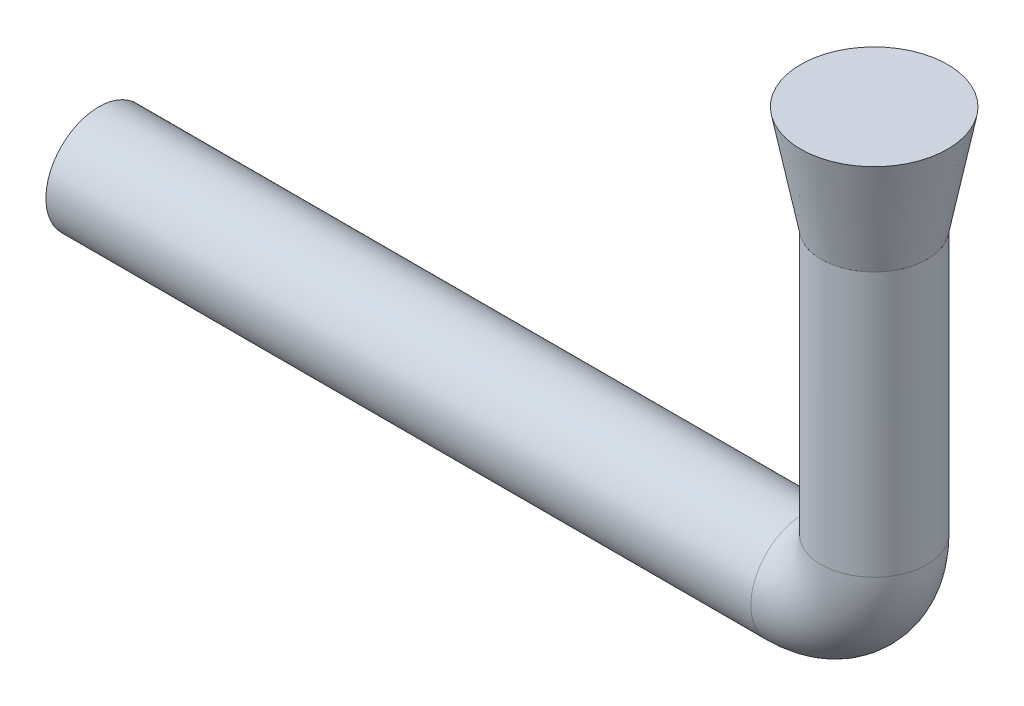
ISO-10303-21;
HEADER;
FILE_DESCRIPTION(('STEP AP214'),'2;1');
FILE_NAME('part.step','',(''),(''),'','','');
FILE_SCHEMA(('AUTOMOTIVE_DESIGN { 1 0 10303 214 1 1 1 1 }'));
ENDSEC;
DATA;
#1=APPLICATION_CONTEXT('core data for automotive mechanical design processes');
#2=APPLICATION_PROTOCOL_DEFINITION('international standard','automotive_design',2000,#1);
#3=PRODUCT_CONTEXT('',#1,'mechanical');
#4=PRODUCT('Part','Part','',(#3));
#5=PRODUCT_RELATED_PRODUCT_CATEGORY('part','',(#4));
#6=PRODUCT_DEFINITION_FORMATION('','',#4);
#7=PRODUCT_DEFINITION_CONTEXT('part definition',#1,'design');
#8=PRODUCT_DEFINITION('design','',#6,#7);
#9=PRODUCT_DEFINITION_SHAPE('','',#8);
#10=(LENGTH_UNIT() NAMED_UNIT(*) SI_UNIT(.MILLI.,.METRE.));
#11=(NAMED_UNIT(*) PLANE_ANGLE_UNIT() SI_UNIT($,.RADIAN.));
#12=(NAMED_UNIT(*) SI_UNIT($,.STERADIAN.) SOLID_ANGLE_UNIT());
#13=UNCERTAINTY_MEASURE_WITH_UNIT(LENGTH_MEASURE(1.E-05),#10,'distance_accuracy_value','');
#14=(GEOMETRIC_REPRESENTATION_CONTEXT(3) GLOBAL_UNCERTAINTY_ASSIGNED_CONTEXT((#13)) GLOBAL_UNIT_ASSIGNED_CONTEXT((#10,
#11,#12)) REPRESENTATION_CONTEXT('',''));
#15=CARTESIAN_POINT('',(0.,0.,0.));
#16=DIRECTION('',(0.,0.,1.));
#17=DIRECTION('',(1.,0.,0.));
#18=AXIS2_PLACEMENT_3D('',#15,#16,#17);
#19=CARTESIAN_POINT('',(220.,95.,0.));
#20=DIRECTION('',(0.,1.,0.));
#21=DIRECTION('',(0.,0.,1.));
#22=AXIS2_PLACEMENT_3D('',#19,#20,#21);
#23=CONICAL_SURFACE('',#22,15.,0.191986217719376);
#24=CARTESIAN_POINT('',(220.,125.,0.));
#25=DIRECTION('',(0.,1.,0.));
#26=DIRECTION('',(0.,0.,1.));
#27=AXIS2_PLACEMENT_3D('',#24,#25,#26);
#28=CIRCLE('',#27,20.8314092741316);
#29=CARTESIAN_POINT('',(220.,125.,20.8314092741316));
#30=VERTEX_POINT('',#29);
#31=EDGE_CURVE('E12',#30,#30,#28,.T.);
#32=ORIENTED_EDGE('',*,*,#31,.F.);
#33=EDGE_LOOP('',(#32));
#34=FACE_BOUND('',#33,.T.);
#35=CARTESIAN_POINT('',(220.,95.,0.));
#36=DIRECTION('',(0.,1.,0.));
#37=DIRECTION('',(0.,0.,1.));
#38=AXIS2_PLACEMENT_3D('',#35,#36,#37);
#39=CIRCLE('',#38,15.);
#40=CARTESIAN_POINT('',(220.,95.,15.));
#41=VERTEX_POINT('',#40);
#42=EDGE_CURVE('E60',#41,#41,#39,.T.);
#43=ORIENTED_EDGE('',*,*,#42,.T.);
#44=EDGE_LOOP('',(#43));
#45=FACE_BOUND('',#44,.T.);
#46=ADVANCED_FACE('F54',(#34,#45),#23,.T.);
#47=CARTESIAN_POINT('',(220.,125.,0.));
#48=DIRECTION('',(0.,1.,0.));
#49=DIRECTION('',(0.,0.,1.));
#50=AXIS2_PLACEMENT_3D('',#47,#48,#49);
#51=PLANE('',#50);
#52=ORIENTED_EDGE('',*,*,#31,.T.);
#53=EDGE_LOOP('',(#52));
#54=FACE_BOUND('',#53,.T.);
#55=ADVANCED_FACE('F69',(#54),#51,.T.);
#56=CARTESIAN_POINT('',(220.,95.,0.));
#57=DIRECTION('',(0.,1.,0.));
#58=DIRECTION('',(0.,0.,1.));
#59=AXIS2_PLACEMENT_3D('',#56,#57,#58);
#60=PLANE('',#59);
#61=ORIENTED_EDGE('',*,*,#42,.F.);
#62=EDGE_LOOP('',(#61));
#63=FACE_BOUND('',#62,.T.);
#64=ADVANCED_FACE('F67',(#63),#60,.F.);
#65=CLOSED_SHELL('',(#46,#55,#64));
#66=MANIFOLD_SOLID_BREP('B2',#65);
#67=CARTESIAN_POINT('',(0.,0.,0.));
#68=DIRECTION('',(-1.,0.,0.));
#69=DIRECTION('',(0.,0.,-1.));
#70=AXIS2_PLACEMENT_3D('',#67,#68,#69);
#71=PLANE('',#70);
#72=CARTESIAN_POINT('',(0.,0.,0.));
#73=DIRECTION('',(-1.,0.,0.));
#74=DIRECTION('',(0.,0.,-1.));
#75=AXIS2_PLACEMENT_3D('',#72,#73,#74);
#76=CIRCLE('',#75,15.);
#77=CARTESIAN_POINT('',(0.,0.,-15.));
#78=VERTEX_POINT('',#77);
#79=EDGE_CURVE('E106',#78,#78,#76,.T.);
#80=ORIENTED_EDGE('',*,*,#79,.T.);
#81=EDGE_LOOP('',(#80));
#82=FACE_BOUND('',#81,.T.);
#83=ADVANCED_FACE('F94',(#82),#71,.T.);
#84=CARTESIAN_POINT('',(220.,95.,0.));
#85=DIRECTION('',(0.,-1.,0.));
#86=DIRECTION('',(0.,0.,-1.));
#87=AXIS2_PLACEMENT_3D('',#84,#85,#86);
#88=PLANE('',#87);
#89=CARTESIAN_POINT('',(220.,95.,0.));
#90=DIRECTION('',(0.,-1.,0.));
#91=DIRECTION('',(0.,0.,-1.));
#92=AXIS2_PLACEMENT_3D('',#89,#90,#91);
#93=CIRCLE('',#92,15.);
#94=CARTESIAN_POINT('',(220.,95.,-15.));
#95=VERTEX_POINT('',#94);
#96=EDGE_CURVE('E52',#95,#95,#93,.T.);
#97=ORIENTED_EDGE('',*,*,#96,.F.);
#98=EDGE_LOOP('',(#97));
#99=FACE_BOUND('',#98,.T.);
#100=ADVANCED_FACE('F112',(#99),#88,.F.);
#101=CARTESIAN_POINT('',(0.,0.,0.));
#102=DIRECTION('',(1.,0.,0.));
#103=DIRECTION('',(0.,0.,-1.));
#104=AXIS2_PLACEMENT_3D('',#101,#102,#103);
#105=CYLINDRICAL_SURFACE('',#104,15.);
#106=CARTESIAN_POINT('',(200.,0.,0.));
#107=DIRECTION('',(-1.,0.,0.));
#108=DIRECTION('',(0.,0.,-1.));
#109=AXIS2_PLACEMENT_3D('',#106,#107,#108);
#110=CIRCLE('',#109,15.);
#111=CARTESIAN_POINT('',(200.,-15.,0.));
#112=VERTEX_POINT('',#111);
#113=EDGE_CURVE('E137',#112,#112,#110,.T.);
#114=ORIENTED_EDGE('',*,*,#113,.T.);
#115=EDGE_LOOP('',(#114));
#116=FACE_BOUND('',#115,.T.);
#117=ORIENTED_EDGE('',*,*,#79,.F.);
#118=EDGE_LOOP('',(#117));
#119=FACE_BOUND('',#118,.T.);
#120=ADVANCED_FACE('F114',(#116,#119),#105,.T.);
#121=CARTESIAN_POINT('',(200.,20.,0.));
#122=DIRECTION('',(0.,0.,1.));
#123=DIRECTION('',(1.,0.,0.));
#124=AXIS2_PLACEMENT_3D('',#121,#122,#123);
#125=TOROIDAL_SURFACE('',#124,20.,15.);
#126=CARTESIAN_POINT('',(220.,20.,0.));
#127=DIRECTION('',(0.,-1.,0.));
#128=DIRECTION('',(0.,0.,-1.));
#129=AXIS2_PLACEMENT_3D('',#126,#127,#128);
#130=CIRCLE('',#129,15.);
#131=CARTESIAN_POINT('',(235.,20.,0.));
#132=VERTEX_POINT('',#131);
#133=EDGE_CURVE('E101',#132,#132,#130,.T.);
#134=CARTESIAN_POINT('',(200.,20.,0.));
#135=DIRECTION('',(0.,0.,1.));
#136=DIRECTION('',(1.,0.,0.));
#137=AXIS2_PLACEMENT_3D('',#134,#135,#136);
#138=CIRCLE('',#137,35.);
#139=EDGE_CURVE('',#112,#132,#138,.T.);
#140=ORIENTED_EDGE('',*,*,#113,.F.);
#141=ORIENTED_EDGE('',*,*,#133,.T.);
#142=ORIENTED_EDGE('',*,*,#139,.T.);
#143=ORIENTED_EDGE('',*,*,#139,.F.);
#144=EDGE_LOOP('',(#140,#142,#141,#143));
#145=FACE_BOUND('',#144,.T.);
#146=ADVANCED_FACE('F119',(#145),#125,.T.);
#147=CARTESIAN_POINT('',(220.,20.,0.));
#148=DIRECTION('',(0.,1.,0.));
#149=DIRECTION('',(0.,0.,1.));
#150=AXIS2_PLACEMENT_3D('',#147,#148,#149);
#151=CYLINDRICAL_SURFACE('',#150,15.);
#152=ORIENTED_EDGE('',*,*,#96,.T.);
#153=EDGE_LOOP('',(#152));
#154=FACE_BOUND('',#153,.T.);
#155=ORIENTED_EDGE('',*,*,#133,.F.);
#156=EDGE_LOOP('',(#155));
#157=FACE_BOUND('',#156,.T.);
#158=ADVANCED_FACE('F109',(#154,#157),#151,.T.);
#159=CLOSED_SHELL('',(#83,#100,#120,#146,#158));
#160=MANIFOLD_SOLID_BREP('B7',#159);
#161=ADVANCED_BREP_SHAPE_REPRESENTATION('',(#18,#66,#160),#14);
#162=SHAPE_DEFINITION_REPRESENTATION(#9,#161);
ENDSEC;
END-ISO-10303-21;
